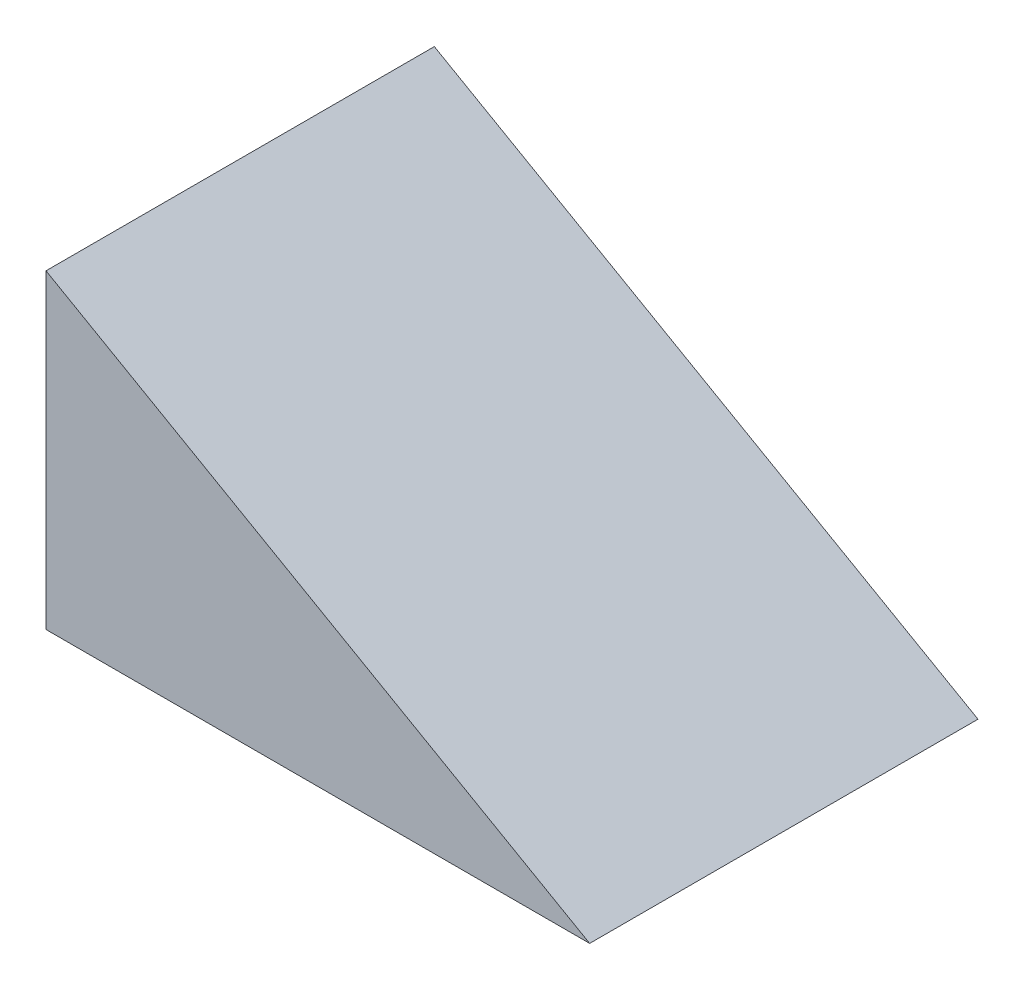
ISO-10303-21;
HEADER;
FILE_DESCRIPTION(('STEP AP214'),'2;1');
FILE_NAME('part.step','',(''),(''),'','','');
FILE_SCHEMA(('AUTOMOTIVE_DESIGN { 1 0 10303 214 1 1 1 1 }'));
ENDSEC;
DATA;
#1=APPLICATION_CONTEXT('core data for automotive mechanical design processes');
#2=APPLICATION_PROTOCOL_DEFINITION('international standard','automotive_design',2000,#1);
#3=PRODUCT_CONTEXT('',#1,'mechanical');
#4=PRODUCT('Part','Part','',(#3));
#5=PRODUCT_RELATED_PRODUCT_CATEGORY('part','',(#4));
#6=PRODUCT_DEFINITION_FORMATION('','',#4);
#7=PRODUCT_DEFINITION_CONTEXT('part definition',#1,'design');
#8=PRODUCT_DEFINITION('design','',#6,#7);
#9=PRODUCT_DEFINITION_SHAPE('','',#8);
#10=(LENGTH_UNIT() NAMED_UNIT(*) SI_UNIT(.MILLI.,.METRE.));
#11=(NAMED_UNIT(*) PLANE_ANGLE_UNIT() SI_UNIT($,.RADIAN.));
#12=(NAMED_UNIT(*) SI_UNIT($,.STERADIAN.) SOLID_ANGLE_UNIT());
#13=UNCERTAINTY_MEASURE_WITH_UNIT(LENGTH_MEASURE(1.E-05),#10,'distance_accuracy_value','');
#14=(GEOMETRIC_REPRESENTATION_CONTEXT(3) GLOBAL_UNCERTAINTY_ASSIGNED_CONTEXT((#13)) GLOBAL_UNIT_ASSIGNED_CONTEXT((#10,
#11,#12)) REPRESENTATION_CONTEXT('',''));
#15=CARTESIAN_POINT('',(0.,0.,0.));
#16=DIRECTION('',(0.,0.,1.));
#17=DIRECTION('',(1.,0.,0.));
#18=AXIS2_PLACEMENT_3D('',#15,#16,#17);
#19=CARTESIAN_POINT('',(0.,0.,50.));
#20=DIRECTION('',(1.,0.,0.));
#21=DIRECTION('',(0.,0.,-1.));
#22=AXIS2_PLACEMENT_3D('',#19,#20,#21);
#23=PLANE('',#22);
#24=DIRECTION('',(0.,-1.,0.));
#25=VECTOR('',#24,1.);
#26=CARTESIAN_POINT('',(0.,0.,0.));
#27=LINE('',#26,#25);
#28=CARTESIAN_POINT('',(0.,40.,0.));
#29=VERTEX_POINT('',#28);
#30=CARTESIAN_POINT('',(0.,0.,0.));
#31=VERTEX_POINT('',#30);
#32=EDGE_CURVE('E79',#29,#31,#27,.T.);
#33=ORIENTED_EDGE('',*,*,#32,.T.);
#34=DIRECTION('',(0.,0.,-1.));
#35=VECTOR('',#34,1.);
#36=CARTESIAN_POINT('',(0.,0.,50.));
#37=LINE('',#36,#35);
#38=CARTESIAN_POINT('',(0.,0.,50.));
#39=VERTEX_POINT('',#38);
#40=EDGE_CURVE('E11',#39,#31,#37,.T.);
#41=ORIENTED_EDGE('',*,*,#40,.F.);
#42=DIRECTION('',(0.,-1.,0.));
#43=VECTOR('',#42,1.);
#44=CARTESIAN_POINT('',(0.,0.,50.));
#45=LINE('',#44,#43);
#46=CARTESIAN_POINT('',(0.,40.,50.));
#47=VERTEX_POINT('',#46);
#48=EDGE_CURVE('E72',#47,#39,#45,.T.);
#49=ORIENTED_EDGE('',*,*,#48,.F.);
#50=DIRECTION('',(0.,0.,-1.));
#51=VECTOR('',#50,1.);
#52=CARTESIAN_POINT('',(0.,40.,50.));
#53=LINE('',#52,#51);
#54=EDGE_CURVE('E80',#47,#29,#53,.T.);
#55=ORIENTED_EDGE('',*,*,#54,.T.);
#56=EDGE_LOOP('',(#33,#41,#49,#55));
#57=FACE_BOUND('',#56,.T.);
#58=ADVANCED_FACE('F32',(#57),#23,.F.);
#59=CARTESIAN_POINT('',(0.,0.,50.));
#60=DIRECTION('',(0.,1.,0.));
#61=DIRECTION('',(0.,0.,1.));
#62=AXIS2_PLACEMENT_3D('',#59,#60,#61);
#63=PLANE('',#62);
#64=DIRECTION('',(1.,0.,0.));
#65=VECTOR('',#64,1.);
#66=CARTESIAN_POINT('',(0.,0.,0.));
#67=LINE('',#66,#65);
#68=CARTESIAN_POINT('',(70.,0.,0.));
#69=VERTEX_POINT('',#68);
#70=EDGE_CURVE('E60',#31,#69,#67,.T.);
#71=ORIENTED_EDGE('',*,*,#70,.T.);
#72=DIRECTION('',(0.,0.,-1.));
#73=VECTOR('',#72,1.);
#74=CARTESIAN_POINT('',(70.,0.,50.));
#75=LINE('',#74,#73);
#76=CARTESIAN_POINT('',(70.,0.,50.));
#77=VERTEX_POINT('',#76);
#78=EDGE_CURVE('E40',#77,#69,#75,.T.);
#79=ORIENTED_EDGE('',*,*,#78,.F.);
#80=DIRECTION('',(1.,0.,0.));
#81=VECTOR('',#80,1.);
#82=CARTESIAN_POINT('',(0.,0.,50.));
#83=LINE('',#82,#81);
#84=EDGE_CURVE('E68',#39,#77,#83,.T.);
#85=ORIENTED_EDGE('',*,*,#84,.F.);
#86=ORIENTED_EDGE('',*,*,#40,.T.);
#87=EDGE_LOOP('',(#71,#79,#85,#86));
#88=FACE_BOUND('',#87,.T.);
#89=ADVANCED_FACE('F69',(#88),#63,.F.);
#90=CARTESIAN_POINT('',(0.,40.,50.));
#91=DIRECTION('',(-0.496138938356834,-0.868243142124459,0.));
#92=DIRECTION('',(0.868243142124459,-0.496138938356834,0.));
#93=AXIS2_PLACEMENT_3D('',#90,#91,#92);
#94=PLANE('',#93);
#95=DIRECTION('',(-0.868243142124459,0.496138938356834,0.));
#96=VECTOR('',#95,1.);
#97=CARTESIAN_POINT('',(0.,40.,0.));
#98=LINE('',#97,#96);
#99=EDGE_CURVE('E65',#69,#29,#98,.T.);
#100=ORIENTED_EDGE('',*,*,#99,.T.);
#101=ORIENTED_EDGE('',*,*,#54,.F.);
#102=DIRECTION('',(-0.868243142124459,0.496138938356834,0.));
#103=VECTOR('',#102,1.);
#104=CARTESIAN_POINT('',(0.,40.,50.));
#105=LINE('',#104,#103);
#106=EDGE_CURVE('E48',#77,#47,#105,.T.);
#107=ORIENTED_EDGE('',*,*,#106,.F.);
#108=ORIENTED_EDGE('',*,*,#78,.T.);
#109=EDGE_LOOP('',(#100,#101,#107,#108));
#110=FACE_BOUND('',#109,.T.);
#111=ADVANCED_FACE('F87',(#110),#94,.F.);
#112=CARTESIAN_POINT('',(0.,0.,50.));
#113=DIRECTION('',(0.,0.,-1.));
#114=DIRECTION('',(-1.,0.,0.));
#115=AXIS2_PLACEMENT_3D('',#112,#113,#114);
#116=PLANE('',#115);
#117=ORIENTED_EDGE('',*,*,#48,.T.);
#118=ORIENTED_EDGE('',*,*,#84,.T.);
#119=ORIENTED_EDGE('',*,*,#106,.T.);
#120=EDGE_LOOP('',(#117,#118,#119));
#121=FACE_BOUND('',#120,.T.);
#122=ADVANCED_FACE('F75',(#121),#116,.F.);
#123=CARTESIAN_POINT('',(0.,0.,0.));
#124=DIRECTION('',(0.,0.,-1.));
#125=DIRECTION('',(-1.,0.,0.));
#126=AXIS2_PLACEMENT_3D('',#123,#124,#125);
#127=PLANE('',#126);
#128=ORIENTED_EDGE('',*,*,#32,.F.);
#129=ORIENTED_EDGE('',*,*,#99,.F.);
#130=ORIENTED_EDGE('',*,*,#70,.F.);
#131=EDGE_LOOP('',(#128,#129,#130));
#132=FACE_BOUND('',#131,.T.);
#133=ADVANCED_FACE('F88',(#132),#127,.T.);
#134=CLOSED_SHELL('',(#58,#89,#111,#122,#133));
#135=MANIFOLD_SOLID_BREP('B2',#134);
#136=ADVANCED_BREP_SHAPE_REPRESENTATION('',(#18,#135),#14);
#137=SHAPE_DEFINITION_REPRESENTATION(#9,#136);
ENDSEC;
END-ISO-10303-21;
